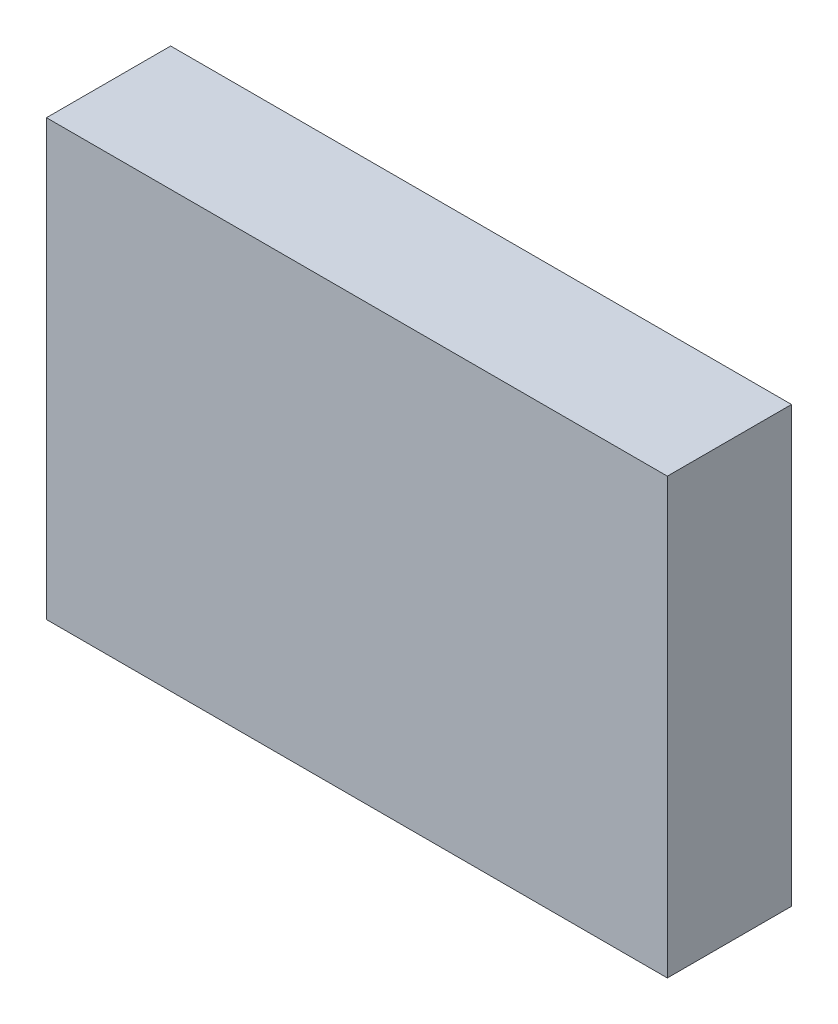
ISO-10303-21;
HEADER;
FILE_DESCRIPTION(('STEP AP214'),'2;1');
FILE_NAME('part.step','',(''),(''),'','','');
FILE_SCHEMA(('AUTOMOTIVE_DESIGN { 1 0 10303 214 1 1 1 1 }'));
ENDSEC;
DATA;
#1=APPLICATION_CONTEXT('core data for automotive mechanical design processes');
#2=APPLICATION_PROTOCOL_DEFINITION('international standard','automotive_design',2000,#1);
#3=PRODUCT_CONTEXT('',#1,'mechanical');
#4=PRODUCT('Part','Part','',(#3));
#5=PRODUCT_RELATED_PRODUCT_CATEGORY('part','',(#4));
#6=PRODUCT_DEFINITION_FORMATION('','',#4);
#7=PRODUCT_DEFINITION_CONTEXT('part definition',#1,'design');
#8=PRODUCT_DEFINITION('design','',#6,#7);
#9=PRODUCT_DEFINITION_SHAPE('','',#8);
#10=(LENGTH_UNIT() NAMED_UNIT(*) SI_UNIT(.MILLI.,.METRE.));
#11=(NAMED_UNIT(*) PLANE_ANGLE_UNIT() SI_UNIT($,.RADIAN.));
#12=(NAMED_UNIT(*) SI_UNIT($,.STERADIAN.) SOLID_ANGLE_UNIT());
#13=UNCERTAINTY_MEASURE_WITH_UNIT(LENGTH_MEASURE(1.E-05),#10,'distance_accuracy_value','');
#14=(GEOMETRIC_REPRESENTATION_CONTEXT(3) GLOBAL_UNCERTAINTY_ASSIGNED_CONTEXT((#13)) GLOBAL_UNIT_ASSIGNED_CONTEXT((#10,
#11,#12)) REPRESENTATION_CONTEXT('',''));
#15=CARTESIAN_POINT('',(0.,0.,0.));
#16=DIRECTION('',(0.,0.,1.));
#17=DIRECTION('',(1.,0.,0.));
#18=AXIS2_PLACEMENT_3D('',#15,#16,#17);
#19=CARTESIAN_POINT('',(50.,-35.,20.));
#20=DIRECTION('',(-1.,0.,0.));
#21=DIRECTION('',(0.,0.,1.));
#22=AXIS2_PLACEMENT_3D('',#19,#20,#21);
#23=PLANE('',#22);
#24=DIRECTION('',(0.,1.,0.));
#25=VECTOR('',#24,1.);
#26=CARTESIAN_POINT('',(50.,-35.,0.));
#27=LINE('',#26,#25);
#28=CARTESIAN_POINT('',(50.,-35.,0.));
#29=VERTEX_POINT('',#28);
#30=CARTESIAN_POINT('',(50.,35.,0.));
#31=VERTEX_POINT('',#30);
#32=EDGE_CURVE('E113',#29,#31,#27,.T.);
#33=ORIENTED_EDGE('',*,*,#32,.T.);
#34=DIRECTION('',(0.,0.,-1.));
#35=VECTOR('',#34,1.);
#36=CARTESIAN_POINT('',(50.,35.,20.));
#37=LINE('',#36,#35);
#38=CARTESIAN_POINT('',(50.,35.,20.));
#39=VERTEX_POINT('',#38);
#40=EDGE_CURVE('E11',#39,#31,#37,.T.);
#41=ORIENTED_EDGE('',*,*,#40,.F.);
#42=DIRECTION('',(0.,1.,0.));
#43=VECTOR('',#42,1.);
#44=CARTESIAN_POINT('',(50.,-35.,20.));
#45=LINE('',#44,#43);
#46=CARTESIAN_POINT('',(50.,-35.,20.));
#47=VERTEX_POINT('',#46);
#48=EDGE_CURVE('E97',#47,#39,#45,.T.);
#49=ORIENTED_EDGE('',*,*,#48,.F.);
#50=DIRECTION('',(0.,0.,-1.));
#51=VECTOR('',#50,1.);
#52=CARTESIAN_POINT('',(50.,-35.,20.));
#53=LINE('',#52,#51);
#54=EDGE_CURVE('E109',#47,#29,#53,.T.);
#55=ORIENTED_EDGE('',*,*,#54,.T.);
#56=EDGE_LOOP('',(#33,#41,#49,#55));
#57=FACE_BOUND('',#56,.T.);
#58=ADVANCED_FACE('F45',(#57),#23,.F.);
#59=CARTESIAN_POINT('',(-50.,35.,20.));
#60=DIRECTION('',(0.,-1.,0.));
#61=DIRECTION('',(0.,0.,-1.));
#62=AXIS2_PLACEMENT_3D('',#59,#60,#61);
#63=PLANE('',#62);
#64=DIRECTION('',(-1.,0.,0.));
#65=VECTOR('',#64,1.);
#66=CARTESIAN_POINT('',(-50.,35.,0.));
#67=LINE('',#66,#65);
#68=CARTESIAN_POINT('',(-50.,35.,0.));
#69=VERTEX_POINT('',#68);
#70=EDGE_CURVE('E102',#31,#69,#67,.T.);
#71=ORIENTED_EDGE('',*,*,#70,.T.);
#72=DIRECTION('',(0.,0.,-1.));
#73=VECTOR('',#72,1.);
#74=CARTESIAN_POINT('',(-50.,35.,20.));
#75=LINE('',#74,#73);
#76=CARTESIAN_POINT('',(-50.,35.,20.));
#77=VERTEX_POINT('',#76);
#78=EDGE_CURVE('E54',#77,#69,#75,.T.);
#79=ORIENTED_EDGE('',*,*,#78,.F.);
#80=DIRECTION('',(-1.,0.,0.));
#81=VECTOR('',#80,1.);
#82=CARTESIAN_POINT('',(-50.,35.,20.));
#83=LINE('',#82,#81);
#84=EDGE_CURVE('E92',#39,#77,#83,.T.);
#85=ORIENTED_EDGE('',*,*,#84,.F.);
#86=ORIENTED_EDGE('',*,*,#40,.T.);
#87=EDGE_LOOP('',(#71,#79,#85,#86));
#88=FACE_BOUND('',#87,.T.);
#89=ADVANCED_FACE('F101',(#88),#63,.F.);
#90=CARTESIAN_POINT('',(-50.,-35.,20.));
#91=DIRECTION('',(1.,0.,0.));
#92=DIRECTION('',(0.,0.,-1.));
#93=AXIS2_PLACEMENT_3D('',#90,#91,#92);
#94=PLANE('',#93);
#95=DIRECTION('',(0.,-1.,0.));
#96=VECTOR('',#95,1.);
#97=CARTESIAN_POINT('',(-50.,-35.,0.));
#98=LINE('',#97,#96);
#99=CARTESIAN_POINT('',(-50.,-35.,0.));
#100=VERTEX_POINT('',#99);
#101=EDGE_CURVE('E79',#69,#100,#98,.T.);
#102=ORIENTED_EDGE('',*,*,#101,.T.);
#103=DIRECTION('',(0.,0.,-1.));
#104=VECTOR('',#103,1.);
#105=CARTESIAN_POINT('',(-50.,-35.,20.));
#106=LINE('',#105,#104);
#107=CARTESIAN_POINT('',(-50.,-35.,20.));
#108=VERTEX_POINT('',#107);
#109=EDGE_CURVE('E104',#108,#100,#106,.T.);
#110=ORIENTED_EDGE('',*,*,#109,.F.);
#111=DIRECTION('',(0.,-1.,0.));
#112=VECTOR('',#111,1.);
#113=CARTESIAN_POINT('',(-50.,-35.,20.));
#114=LINE('',#113,#112);
#115=EDGE_CURVE('E95',#77,#108,#114,.T.);
#116=ORIENTED_EDGE('',*,*,#115,.F.);
#117=ORIENTED_EDGE('',*,*,#78,.T.);
#118=EDGE_LOOP('',(#102,#110,#116,#117));
#119=FACE_BOUND('',#118,.T.);
#120=ADVANCED_FACE('F105',(#119),#94,.F.);
#121=CARTESIAN_POINT('',(-50.,-35.,20.));
#122=DIRECTION('',(0.,1.,0.));
#123=DIRECTION('',(0.,0.,1.));
#124=AXIS2_PLACEMENT_3D('',#121,#122,#123);
#125=PLANE('',#124);
#126=DIRECTION('',(1.,0.,0.));
#127=VECTOR('',#126,1.);
#128=CARTESIAN_POINT('',(-50.,-35.,0.));
#129=LINE('',#128,#127);
#130=EDGE_CURVE('E85',#100,#29,#129,.T.);
#131=ORIENTED_EDGE('',*,*,#130,.T.);
#132=ORIENTED_EDGE('',*,*,#54,.F.);
#133=DIRECTION('',(1.,0.,0.));
#134=VECTOR('',#133,1.);
#135=CARTESIAN_POINT('',(-50.,-35.,20.));
#136=LINE('',#135,#134);
#137=EDGE_CURVE('E62',#108,#47,#136,.T.);
#138=ORIENTED_EDGE('',*,*,#137,.F.);
#139=ORIENTED_EDGE('',*,*,#109,.T.);
#140=EDGE_LOOP('',(#131,#132,#138,#139));
#141=FACE_BOUND('',#140,.T.);
#142=ADVANCED_FACE('F126',(#141),#125,.F.);
#143=CARTESIAN_POINT('',(0.,0.,20.));
#144=DIRECTION('',(0.,0.,-1.));
#145=DIRECTION('',(-1.,0.,0.));
#146=AXIS2_PLACEMENT_3D('',#143,#144,#145);
#147=PLANE('',#146);
#148=ORIENTED_EDGE('',*,*,#48,.T.);
#149=ORIENTED_EDGE('',*,*,#84,.T.);
#150=ORIENTED_EDGE('',*,*,#115,.T.);
#151=ORIENTED_EDGE('',*,*,#137,.T.);
#152=EDGE_LOOP('',(#148,#149,#150,#151));
#153=FACE_BOUND('',#152,.T.);
#154=ADVANCED_FACE('F93',(#153),#147,.F.);
#155=CARTESIAN_POINT('',(0.,0.,0.));
#156=DIRECTION('',(0.,0.,-1.));
#157=DIRECTION('',(-1.,0.,0.));
#158=AXIS2_PLACEMENT_3D('',#155,#156,#157);
#159=PLANE('',#158);
#160=ORIENTED_EDGE('',*,*,#32,.F.);
#161=ORIENTED_EDGE('',*,*,#130,.F.);
#162=ORIENTED_EDGE('',*,*,#101,.F.);
#163=ORIENTED_EDGE('',*,*,#70,.F.);
#164=EDGE_LOOP('',(#160,#161,#162,#163));
#165=FACE_BOUND('',#164,.T.);
#166=ADVANCED_FACE('F129',(#165),#159,.T.);
#167=CLOSED_SHELL('',(#58,#89,#120,#142,#154,#166));
#168=MANIFOLD_SOLID_BREP('B2',#167);
#169=ADVANCED_BREP_SHAPE_REPRESENTATION('',(#18,#168),#14);
#170=SHAPE_DEFINITION_REPRESENTATION(#9,#169);
ENDSEC;
END-ISO-10303-21;
